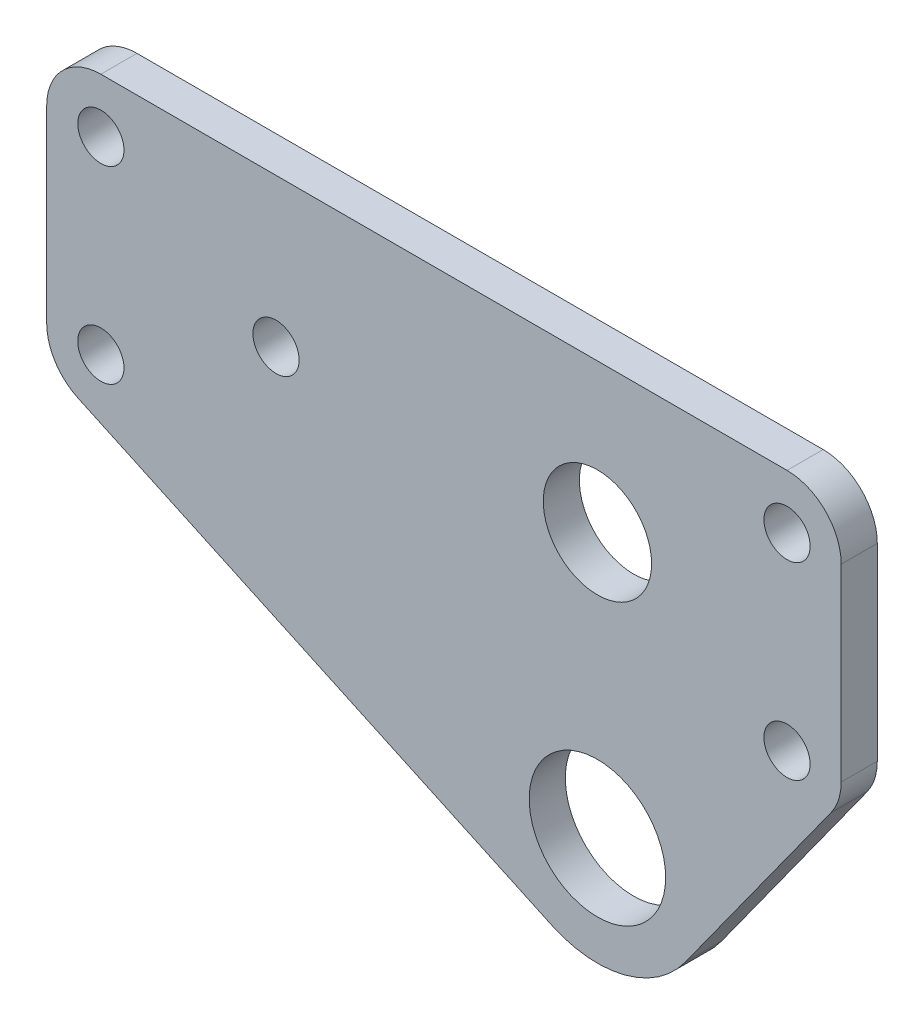
ISO-10303-21;
HEADER;
FILE_DESCRIPTION(('STEP AP214'),'2;1');
FILE_NAME('part.step','',(''),(''),'','','');
FILE_SCHEMA(('AUTOMOTIVE_DESIGN { 1 0 10303 214 1 1 1 1 }'));
ENDSEC;
DATA;
#1=APPLICATION_CONTEXT('core data for automotive mechanical design processes');
#2=APPLICATION_PROTOCOL_DEFINITION('international standard','automotive_design',2000,#1);
#3=PRODUCT_CONTEXT('',#1,'mechanical');
#4=PRODUCT('Part','Part','',(#3));
#5=PRODUCT_RELATED_PRODUCT_CATEGORY('part','',(#4));
#6=PRODUCT_DEFINITION_FORMATION('','',#4);
#7=PRODUCT_DEFINITION_CONTEXT('part definition',#1,'design');
#8=PRODUCT_DEFINITION('design','',#6,#7);
#9=PRODUCT_DEFINITION_SHAPE('','',#8);
#10=(LENGTH_UNIT() NAMED_UNIT(*) SI_UNIT(.MILLI.,.METRE.));
#11=(NAMED_UNIT(*) PLANE_ANGLE_UNIT() SI_UNIT($,.RADIAN.));
#12=(NAMED_UNIT(*) SI_UNIT($,.STERADIAN.) SOLID_ANGLE_UNIT());
#13=UNCERTAINTY_MEASURE_WITH_UNIT(LENGTH_MEASURE(1.E-05),#10,'distance_accuracy_value','');
#14=(GEOMETRIC_REPRESENTATION_CONTEXT(3) GLOBAL_UNCERTAINTY_ASSIGNED_CONTEXT((#13)) GLOBAL_UNIT_ASSIGNED_CONTEXT((#10,
#11,#12)) REPRESENTATION_CONTEXT('',''));
#15=CARTESIAN_POINT('',(0.,0.,0.));
#16=DIRECTION('',(0.,0.,1.));
#17=DIRECTION('',(1.,0.,0.));
#18=AXIS2_PLACEMENT_3D('',#15,#16,#17);
#19=CARTESIAN_POINT('',(43.65625,-8.29309999999999,3.175));
#20=DIRECTION('',(0.,0.,-1.));
#21=DIRECTION('',(-1.,0.,0.));
#22=AXIS2_PLACEMENT_3D('',#19,#20,#21);
#23=CYLINDRICAL_SURFACE('',#22,4.7625);
#24=DIRECTION('',(0.,0.,1.));
#25=VECTOR('',#24,1.);
#26=CARTESIAN_POINT('',(47.520433425221,-11.0768910672763,-69.6683702911285));
#27=LINE('',#26,#25);
#28=CARTESIAN_POINT('',(47.520433425221,-11.0768910672763,0.));
#29=VERTEX_POINT('',#28);
#30=CARTESIAN_POINT('',(47.520433425221,-11.0768910672763,3.175));
#31=VERTEX_POINT('',#30);
#32=EDGE_CURVE('E126',#29,#31,#27,.T.);
#33=ORIENTED_EDGE('',*,*,#32,.F.);
#34=CARTESIAN_POINT('',(43.65625,-8.29309999999999,0.));
#35=DIRECTION('',(0.,0.,1.));
#36=DIRECTION('',(1.,0.,0.));
#37=AXIS2_PLACEMENT_3D('',#34,#35,#36);
#38=CIRCLE('',#37,4.7625);
#39=CARTESIAN_POINT('',(48.41875,-8.29309999999999,0.));
#40=VERTEX_POINT('',#39);
#41=EDGE_CURVE('E218',#29,#40,#38,.T.);
#42=ORIENTED_EDGE('',*,*,#41,.T.);
#43=DIRECTION('',(0.,0.,-1.));
#44=VECTOR('',#43,1.);
#45=CARTESIAN_POINT('',(48.41875,-8.29309999999999,3.175));
#46=LINE('',#45,#44);
#47=CARTESIAN_POINT('',(48.41875,-8.29309999999999,3.175));
#48=VERTEX_POINT('',#47);
#49=EDGE_CURVE('E221',#48,#40,#46,.T.);
#50=ORIENTED_EDGE('',*,*,#49,.F.);
#51=CARTESIAN_POINT('',(43.65625,-8.29309999999999,3.175));
#52=DIRECTION('',(0.,0.,1.));
#53=DIRECTION('',(1.,0.,0.));
#54=AXIS2_PLACEMENT_3D('',#51,#52,#53);
#55=CIRCLE('',#54,4.7625);
#56=EDGE_CURVE('E202',#31,#48,#55,.T.);
#57=ORIENTED_EDGE('',*,*,#56,.F.);
#58=EDGE_LOOP('',(#33,#42,#50,#57));
#59=FACE_BOUND('',#58,.T.);
#60=ADVANCED_FACE('F39',(#59),#23,.T.);
#61=CARTESIAN_POINT('',(43.65625,8.29310000000001,3.175));
#62=DIRECTION('',(0.,0.,1.));
#63=DIRECTION('',(1.,0.,0.));
#64=AXIS2_PLACEMENT_3D('',#61,#62,#63);
#65=PLANE('',#64);
#66=CARTESIAN_POINT('',(-16.66875,-8.2931,3.175));
#67=DIRECTION('',(0.,0.,1.));
#68=DIRECTION('',(-1.,0.,0.));
#69=AXIS2_PLACEMENT_3D('',#66,#67,#68);
#70=CIRCLE('',#69,4.7625);
#71=CARTESIAN_POINT('',(-21.43125,-8.2931,3.175));
#72=VERTEX_POINT('',#71);
#73=CARTESIAN_POINT('',(-18.6719065249047,-12.6138372272254,3.175));
#74=VERTEX_POINT('',#73);
#75=EDGE_CURVE('E201',#72,#74,#70,.T.);
#76=ORIENTED_EDGE('',*,*,#75,.T.);
#77=DIRECTION('',(0.907241412540773,-0.420610293943244,0.));
#78=VECTOR('',#77,1.);
#79=CARTESIAN_POINT('',(22.9811869501906,-31.9248162544509,3.175));
#80=LINE('',#79,#78);
#81=CARTESIAN_POINT('',(22.9811869501906,-31.9248162544509,3.175));
#82=VERTEX_POINT('',#81);
#83=EDGE_CURVE('E129',#74,#82,#80,.T.);
#84=ORIENTED_EDGE('',*,*,#83,.T.);
#85=CARTESIAN_POINT('',(26.9875,-23.2833418,3.175));
#86=DIRECTION('',(0.,0.,1.));
#87=DIRECTION('',(1.,0.,0.));
#88=AXIS2_PLACEMENT_3D('',#85,#86,#87);
#89=CIRCLE('',#88,9.525);
#90=CARTESIAN_POINT('',(34.715866850442,-28.8509239345526,3.175));
#91=VERTEX_POINT('',#90);
#92=EDGE_CURVE('E125',#82,#91,#89,.T.);
#93=ORIENTED_EDGE('',*,*,#92,.T.);
#94=DIRECTION('',(0.584523058745685,0.81137709715926,0.));
#95=VECTOR('',#94,1.);
#96=CARTESIAN_POINT('',(34.715866850442,-28.8509239345526,3.175));
#97=LINE('',#96,#95);
#98=EDGE_CURVE('E135',#91,#31,#97,.T.);
#99=ORIENTED_EDGE('',*,*,#98,.T.);
#100=ORIENTED_EDGE('',*,*,#56,.T.);
#101=DIRECTION('',(0.,1.,0.));
#102=VECTOR('',#101,1.);
#103=CARTESIAN_POINT('',(48.41875,-8.29309999999999,3.175));
#104=LINE('',#103,#102);
#105=CARTESIAN_POINT('',(48.41875,8.29310000000001,3.175));
#106=VERTEX_POINT('',#105);
#107=EDGE_CURVE('E210',#48,#106,#104,.T.);
#108=ORIENTED_EDGE('',*,*,#107,.T.);
#109=CARTESIAN_POINT('',(43.65625,8.29310000000001,3.175));
#110=DIRECTION('',(0.,0.,1.));
#111=DIRECTION('',(1.,0.,0.));
#112=AXIS2_PLACEMENT_3D('',#109,#110,#111);
#113=CIRCLE('',#112,4.7625);
#114=CARTESIAN_POINT('',(43.65625,13.0556,3.175));
#115=VERTEX_POINT('',#114);
#116=EDGE_CURVE('E195',#106,#115,#113,.T.);
#117=ORIENTED_EDGE('',*,*,#116,.T.);
#118=DIRECTION('',(-1.,0.,0.));
#119=VECTOR('',#118,1.);
#120=CARTESIAN_POINT('',(43.65625,13.0556,3.175));
#121=LINE('',#120,#119);
#122=CARTESIAN_POINT('',(-16.66875,13.0556,3.175));
#123=VERTEX_POINT('',#122);
#124=EDGE_CURVE('E198',#115,#123,#121,.T.);
#125=ORIENTED_EDGE('',*,*,#124,.T.);
#126=CARTESIAN_POINT('',(-16.66875,8.2931,3.175));
#127=DIRECTION('',(0.,0.,1.));
#128=DIRECTION('',(1.,0.,0.));
#129=AXIS2_PLACEMENT_3D('',#126,#127,#128);
#130=CIRCLE('',#129,4.7625);
#131=CARTESIAN_POINT('',(-21.43125,8.2931,3.175));
#132=VERTEX_POINT('',#131);
#133=EDGE_CURVE('E200',#123,#132,#130,.T.);
#134=ORIENTED_EDGE('',*,*,#133,.T.);
#135=DIRECTION('',(0.,-1.,0.));
#136=VECTOR('',#135,1.);
#137=CARTESIAN_POINT('',(-21.43125,-8.2931,3.175));
#138=LINE('',#137,#136);
#139=EDGE_CURVE('E203',#132,#72,#138,.T.);
#140=ORIENTED_EDGE('',*,*,#139,.T.);
#141=EDGE_LOOP('',(#76,#84,#93,#99,#100,#108,#117,#125,#134,#140));
#142=FACE_BOUND('',#141,.T.);
#143=CARTESIAN_POINT('',(43.65625,-8.29309999999999,3.175));
#144=DIRECTION('',(0.,0.,1.));
#145=DIRECTION('',(1.,0.,0.));
#146=AXIS2_PLACEMENT_3D('',#143,#144,#145);
#147=CIRCLE('',#146,2.032);
#148=CARTESIAN_POINT('',(45.68825,-8.29309999999999,3.175));
#149=VERTEX_POINT('',#148);
#150=EDGE_CURVE('E162',#149,#149,#147,.T.);
#151=ORIENTED_EDGE('',*,*,#150,.F.);
#152=EDGE_LOOP('',(#151));
#153=FACE_BOUND('',#152,.T.);
#154=CARTESIAN_POINT('',(43.65625,8.29310000000001,3.175));
#155=DIRECTION('',(0.,0.,1.));
#156=DIRECTION('',(1.,0.,0.));
#157=AXIS2_PLACEMENT_3D('',#154,#155,#156);
#158=CIRCLE('',#157,2.032);
#159=CARTESIAN_POINT('',(45.68825,8.29310000000001,3.175));
#160=VERTEX_POINT('',#159);
#161=EDGE_CURVE('E172',#160,#160,#158,.T.);
#162=ORIENTED_EDGE('',*,*,#161,.F.);
#163=EDGE_LOOP('',(#162));
#164=FACE_BOUND('',#163,.T.);
#165=CARTESIAN_POINT('',(26.9875,0.,3.175));
#166=DIRECTION('',(0.,0.,1.));
#167=DIRECTION('',(1.,0.,0.));
#168=AXIS2_PLACEMENT_3D('',#165,#166,#167);
#169=CIRCLE('',#168,4.7625);
#170=CARTESIAN_POINT('',(31.75,0.,3.175));
#171=VERTEX_POINT('',#170);
#172=EDGE_CURVE('E186',#171,#171,#169,.T.);
#173=ORIENTED_EDGE('',*,*,#172,.F.);
#174=EDGE_LOOP('',(#173));
#175=FACE_BOUND('',#174,.T.);
#176=CARTESIAN_POINT('',(-16.66875,8.2931,3.175));
#177=DIRECTION('',(0.,0.,1.));
#178=DIRECTION('',(1.,0.,0.));
#179=AXIS2_PLACEMENT_3D('',#176,#177,#178);
#180=CIRCLE('',#179,2.032);
#181=CARTESIAN_POINT('',(-14.63675,8.2931,3.175));
#182=VERTEX_POINT('',#181);
#183=EDGE_CURVE('E182',#182,#182,#180,.T.);
#184=ORIENTED_EDGE('',*,*,#183,.F.);
#185=EDGE_LOOP('',(#184));
#186=FACE_BOUND('',#185,.T.);
#187=CARTESIAN_POINT('',(-16.66875,-8.2931,3.175));
#188=DIRECTION('',(0.,0.,1.));
#189=DIRECTION('',(1.,0.,0.));
#190=AXIS2_PLACEMENT_3D('',#187,#188,#189);
#191=CIRCLE('',#190,2.032);
#192=CARTESIAN_POINT('',(-14.63675,-8.2931,3.175));
#193=VERTEX_POINT('',#192);
#194=EDGE_CURVE('E166',#193,#193,#191,.T.);
#195=ORIENTED_EDGE('',*,*,#194,.F.);
#196=EDGE_LOOP('',(#195));
#197=FACE_BOUND('',#196,.T.);
#198=CARTESIAN_POINT('',(-1.27,0.,3.175));
#199=DIRECTION('',(0.,0.,1.));
#200=DIRECTION('',(1.,0.,0.));
#201=AXIS2_PLACEMENT_3D('',#198,#199,#200);
#202=CIRCLE('',#201,2.032);
#203=CARTESIAN_POINT('',(0.761999999999996,0.,3.175));
#204=VERTEX_POINT('',#203);
#205=EDGE_CURVE('E160',#204,#204,#202,.T.);
#206=ORIENTED_EDGE('',*,*,#205,.F.);
#207=EDGE_LOOP('',(#206));
#208=FACE_BOUND('',#207,.T.);
#209=CARTESIAN_POINT('',(26.9875,-23.2833418,3.175));
#210=DIRECTION('',(0.,0.,1.));
#211=DIRECTION('',(1.,0.,0.));
#212=AXIS2_PLACEMENT_3D('',#209,#210,#211);
#213=CIRCLE('',#212,6.);
#214=CARTESIAN_POINT('',(32.9875,-23.2833418,3.175));
#215=VERTEX_POINT('',#214);
#216=EDGE_CURVE('E137',#215,#215,#213,.T.);
#217=ORIENTED_EDGE('',*,*,#216,.F.);
#218=EDGE_LOOP('',(#217));
#219=FACE_BOUND('',#218,.T.);
#220=ADVANCED_FACE('F136',(#142,#153,#164,#175,#186,#197,#208,#219),#65,.T.);
#221=CARTESIAN_POINT('',(43.65625,8.29310000000001,0.));
#222=DIRECTION('',(0.,0.,1.));
#223=DIRECTION('',(1.,0.,0.));
#224=AXIS2_PLACEMENT_3D('',#221,#222,#223);
#225=PLANE('',#224);
#226=ORIENTED_EDGE('',*,*,#41,.F.);
#227=DIRECTION('',(-0.584523058745685,-0.81137709715926,0.));
#228=VECTOR('',#227,1.);
#229=CARTESIAN_POINT('',(34.715866850442,-28.8509239345526,0.));
#230=LINE('',#229,#228);
#231=CARTESIAN_POINT('',(34.715866850442,-28.8509239345526,0.));
#232=VERTEX_POINT('',#231);
#233=EDGE_CURVE('E156',#29,#232,#230,.T.);
#234=ORIENTED_EDGE('',*,*,#233,.T.);
#235=CARTESIAN_POINT('',(26.9875,-23.2833418,0.));
#236=DIRECTION('',(0.,0.,1.));
#237=DIRECTION('',(1.,0.,0.));
#238=AXIS2_PLACEMENT_3D('',#235,#236,#237);
#239=CIRCLE('',#238,9.525);
#240=CARTESIAN_POINT('',(22.9811869501906,-31.9248162544509,0.));
#241=VERTEX_POINT('',#240);
#242=EDGE_CURVE('E122',#232,#241,#239,.F.);
#243=ORIENTED_EDGE('',*,*,#242,.T.);
#244=DIRECTION('',(-0.907241412540774,0.420610293943244,0.));
#245=VECTOR('',#244,1.);
#246=CARTESIAN_POINT('',(22.9811869501906,-31.9248162544509,0.));
#247=LINE('',#246,#245);
#248=CARTESIAN_POINT('',(-18.6719065249047,-12.6138372272254,0.));
#249=VERTEX_POINT('',#248);
#250=EDGE_CURVE('E149',#241,#249,#247,.T.);
#251=ORIENTED_EDGE('',*,*,#250,.T.);
#252=CARTESIAN_POINT('',(-16.66875,-8.2931,0.));
#253=DIRECTION('',(0.,0.,1.));
#254=DIRECTION('',(-1.,0.,0.));
#255=AXIS2_PLACEMENT_3D('',#252,#253,#254);
#256=CIRCLE('',#255,4.7625);
#257=CARTESIAN_POINT('',(-21.43125,-8.2931,0.));
#258=VERTEX_POINT('',#257);
#259=EDGE_CURVE('E56',#258,#249,#256,.T.);
#260=ORIENTED_EDGE('',*,*,#259,.F.);
#261=DIRECTION('',(0.,-1.,0.));
#262=VECTOR('',#261,1.);
#263=CARTESIAN_POINT('',(-21.43125,-8.2931,0.));
#264=LINE('',#263,#262);
#265=CARTESIAN_POINT('',(-21.43125,8.2931,0.));
#266=VERTEX_POINT('',#265);
#267=EDGE_CURVE('E216',#266,#258,#264,.T.);
#268=ORIENTED_EDGE('',*,*,#267,.F.);
#269=CARTESIAN_POINT('',(-16.66875,8.2931,0.));
#270=DIRECTION('',(0.,0.,1.));
#271=DIRECTION('',(1.,0.,0.));
#272=AXIS2_PLACEMENT_3D('',#269,#270,#271);
#273=CIRCLE('',#272,4.7625);
#274=CARTESIAN_POINT('',(-16.66875,13.0556,0.));
#275=VERTEX_POINT('',#274);
#276=EDGE_CURVE('E212',#275,#266,#273,.T.);
#277=ORIENTED_EDGE('',*,*,#276,.F.);
#278=DIRECTION('',(-1.,0.,0.));
#279=VECTOR('',#278,1.);
#280=CARTESIAN_POINT('',(43.65625,13.0556,0.));
#281=LINE('',#280,#279);
#282=CARTESIAN_POINT('',(43.65625,13.0556,0.));
#283=VERTEX_POINT('',#282);
#284=EDGE_CURVE('E215',#283,#275,#281,.T.);
#285=ORIENTED_EDGE('',*,*,#284,.F.);
#286=CARTESIAN_POINT('',(43.65625,8.29310000000001,0.));
#287=DIRECTION('',(0.,0.,1.));
#288=DIRECTION('',(1.,0.,0.));
#289=AXIS2_PLACEMENT_3D('',#286,#287,#288);
#290=CIRCLE('',#289,4.7625);
#291=CARTESIAN_POINT('',(48.41875,8.29310000000001,0.));
#292=VERTEX_POINT('',#291);
#293=EDGE_CURVE('E187',#292,#283,#290,.T.);
#294=ORIENTED_EDGE('',*,*,#293,.F.);
#295=DIRECTION('',(0.,1.,0.));
#296=VECTOR('',#295,1.);
#297=CARTESIAN_POINT('',(48.41875,-8.29309999999999,0.));
#298=LINE('',#297,#296);
#299=EDGE_CURVE('E197',#40,#292,#298,.T.);
#300=ORIENTED_EDGE('',*,*,#299,.F.);
#301=EDGE_LOOP('',(#226,#234,#243,#251,#260,#268,#277,#285,#294,#300));
#302=FACE_BOUND('',#301,.T.);
#303=CARTESIAN_POINT('',(26.9875,0.,0.));
#304=DIRECTION('',(0.,0.,1.));
#305=DIRECTION('',(1.,0.,0.));
#306=AXIS2_PLACEMENT_3D('',#303,#304,#305);
#307=CIRCLE('',#306,4.7625);
#308=CARTESIAN_POINT('',(31.75,0.,0.));
#309=VERTEX_POINT('',#308);
#310=EDGE_CURVE('E184',#309,#309,#307,.T.);
#311=ORIENTED_EDGE('',*,*,#310,.T.);
#312=EDGE_LOOP('',(#311));
#313=FACE_BOUND('',#312,.T.);
#314=CARTESIAN_POINT('',(-16.66875,8.2931,0.));
#315=DIRECTION('',(0.,0.,1.));
#316=DIRECTION('',(1.,0.,0.));
#317=AXIS2_PLACEMENT_3D('',#314,#315,#316);
#318=CIRCLE('',#317,2.032);
#319=CARTESIAN_POINT('',(-14.63675,8.2931,0.));
#320=VERTEX_POINT('',#319);
#321=EDGE_CURVE('E180',#320,#320,#318,.T.);
#322=ORIENTED_EDGE('',*,*,#321,.T.);
#323=EDGE_LOOP('',(#322));
#324=FACE_BOUND('',#323,.T.);
#325=CARTESIAN_POINT('',(43.65625,8.29310000000001,0.));
#326=DIRECTION('',(0.,0.,1.));
#327=DIRECTION('',(1.,0.,0.));
#328=AXIS2_PLACEMENT_3D('',#325,#326,#327);
#329=CIRCLE('',#328,2.032);
#330=CARTESIAN_POINT('',(45.68825,8.29310000000001,0.));
#331=VERTEX_POINT('',#330);
#332=EDGE_CURVE('E171',#331,#331,#329,.T.);
#333=ORIENTED_EDGE('',*,*,#332,.T.);
#334=EDGE_LOOP('',(#333));
#335=FACE_BOUND('',#334,.T.);
#336=CARTESIAN_POINT('',(-16.66875,-8.2931,0.));
#337=DIRECTION('',(0.,0.,1.));
#338=DIRECTION('',(1.,0.,0.));
#339=AXIS2_PLACEMENT_3D('',#336,#337,#338);
#340=CIRCLE('',#339,2.032);
#341=CARTESIAN_POINT('',(-14.63675,-8.2931,0.));
#342=VERTEX_POINT('',#341);
#343=EDGE_CURVE('E167',#342,#342,#340,.T.);
#344=ORIENTED_EDGE('',*,*,#343,.T.);
#345=EDGE_LOOP('',(#344));
#346=FACE_BOUND('',#345,.T.);
#347=CARTESIAN_POINT('',(43.65625,-8.29309999999999,0.));
#348=DIRECTION('',(0.,0.,1.));
#349=DIRECTION('',(1.,0.,0.));
#350=AXIS2_PLACEMENT_3D('',#347,#348,#349);
#351=CIRCLE('',#350,2.032);
#352=CARTESIAN_POINT('',(45.68825,-8.29309999999999,0.));
#353=VERTEX_POINT('',#352);
#354=EDGE_CURVE('E159',#353,#353,#351,.T.);
#355=ORIENTED_EDGE('',*,*,#354,.T.);
#356=EDGE_LOOP('',(#355));
#357=FACE_BOUND('',#356,.T.);
#358=CARTESIAN_POINT('',(-1.27,0.,0.));
#359=DIRECTION('',(0.,0.,1.));
#360=DIRECTION('',(1.,0.,0.));
#361=AXIS2_PLACEMENT_3D('',#358,#359,#360);
#362=CIRCLE('',#361,2.032);
#363=CARTESIAN_POINT('',(0.761999999999996,0.,0.));
#364=VERTEX_POINT('',#363);
#365=EDGE_CURVE('E154',#364,#364,#362,.T.);
#366=ORIENTED_EDGE('',*,*,#365,.T.);
#367=EDGE_LOOP('',(#366));
#368=FACE_BOUND('',#367,.T.);
#369=CARTESIAN_POINT('',(26.9875,-23.2833418,0.));
#370=DIRECTION('',(0.,0.,1.));
#371=DIRECTION('',(1.,0.,0.));
#372=AXIS2_PLACEMENT_3D('',#369,#370,#371);
#373=CIRCLE('',#372,6.);
#374=CARTESIAN_POINT('',(32.9875,-23.2833418,0.));
#375=VERTEX_POINT('',#374);
#376=EDGE_CURVE('E155',#375,#375,#373,.F.);
#377=ORIENTED_EDGE('',*,*,#376,.F.);
#378=EDGE_LOOP('',(#377));
#379=FACE_BOUND('',#378,.T.);
#380=ADVANCED_FACE('F241',(#302,#313,#324,#335,#346,#357,#368,#379),#225,.F.);
#381=CARTESIAN_POINT('',(43.65625,8.29310000000001,3.175));
#382=DIRECTION('',(0.,0.,-1.));
#383=DIRECTION('',(-1.,0.,0.));
#384=AXIS2_PLACEMENT_3D('',#381,#382,#383);
#385=CYLINDRICAL_SURFACE('',#384,4.7625);
#386=ORIENTED_EDGE('',*,*,#293,.T.);
#387=DIRECTION('',(0.,0.,-1.));
#388=VECTOR('',#387,1.);
#389=CARTESIAN_POINT('',(43.65625,13.0556,3.175));
#390=LINE('',#389,#388);
#391=EDGE_CURVE('E11',#115,#283,#390,.T.);
#392=ORIENTED_EDGE('',*,*,#391,.F.);
#393=ORIENTED_EDGE('',*,*,#116,.F.);
#394=DIRECTION('',(0.,0.,-1.));
#395=VECTOR('',#394,1.);
#396=CARTESIAN_POINT('',(48.41875,8.29310000000001,3.175));
#397=LINE('',#396,#395);
#398=EDGE_CURVE('E207',#106,#292,#397,.T.);
#399=ORIENTED_EDGE('',*,*,#398,.T.);
#400=EDGE_LOOP('',(#386,#392,#393,#399));
#401=FACE_BOUND('',#400,.T.);
#402=ADVANCED_FACE('F41',(#401),#385,.T.);
#403=CARTESIAN_POINT('',(43.65625,13.0556,3.175));
#404=DIRECTION('',(0.,-1.,0.));
#405=DIRECTION('',(1.,0.,0.));
#406=AXIS2_PLACEMENT_3D('',#403,#404,#405);
#407=PLANE('',#406);
#408=ORIENTED_EDGE('',*,*,#284,.T.);
#409=DIRECTION('',(0.,0.,-1.));
#410=VECTOR('',#409,1.);
#411=CARTESIAN_POINT('',(-16.66875,13.0556,3.175));
#412=LINE('',#411,#410);
#413=EDGE_CURVE('E50',#123,#275,#412,.T.);
#414=ORIENTED_EDGE('',*,*,#413,.F.);
#415=ORIENTED_EDGE('',*,*,#124,.F.);
#416=ORIENTED_EDGE('',*,*,#391,.T.);
#417=EDGE_LOOP('',(#408,#414,#415,#416));
#418=FACE_BOUND('',#417,.T.);
#419=ADVANCED_FACE('F264',(#418),#407,.F.);
#420=CARTESIAN_POINT('',(-16.66875,8.2931,3.175));
#421=DIRECTION('',(0.,0.,-1.));
#422=DIRECTION('',(-1.,0.,0.));
#423=AXIS2_PLACEMENT_3D('',#420,#421,#422);
#424=CYLINDRICAL_SURFACE('',#423,4.7625);
#425=ORIENTED_EDGE('',*,*,#276,.T.);
#426=DIRECTION('',(0.,0.,-1.));
#427=VECTOR('',#426,1.);
#428=CARTESIAN_POINT('',(-21.43125,8.2931,3.175));
#429=LINE('',#428,#427);
#430=EDGE_CURVE('E228',#132,#266,#429,.T.);
#431=ORIENTED_EDGE('',*,*,#430,.F.);
#432=ORIENTED_EDGE('',*,*,#133,.F.);
#433=ORIENTED_EDGE('',*,*,#413,.T.);
#434=EDGE_LOOP('',(#425,#431,#432,#433));
#435=FACE_BOUND('',#434,.T.);
#436=ADVANCED_FACE('F237',(#435),#424,.T.);
#437=CARTESIAN_POINT('',(-21.43125,-8.2931,3.175));
#438=DIRECTION('',(1.,0.,0.));
#439=DIRECTION('',(0.,0.,-1.));
#440=AXIS2_PLACEMENT_3D('',#437,#438,#439);
#441=PLANE('',#440);
#442=ORIENTED_EDGE('',*,*,#267,.T.);
#443=DIRECTION('',(0.,0.,-1.));
#444=VECTOR('',#443,1.);
#445=CARTESIAN_POINT('',(-21.43125,-8.2931,3.175));
#446=LINE('',#445,#444);
#447=EDGE_CURVE('E226',#72,#258,#446,.T.);
#448=ORIENTED_EDGE('',*,*,#447,.F.);
#449=ORIENTED_EDGE('',*,*,#139,.F.);
#450=ORIENTED_EDGE('',*,*,#430,.T.);
#451=EDGE_LOOP('',(#442,#448,#449,#450));
#452=FACE_BOUND('',#451,.T.);
#453=ADVANCED_FACE('F246',(#452),#441,.F.);
#454=CARTESIAN_POINT('',(-16.66875,-8.2931,3.175));
#455=DIRECTION('',(0.,0.,-1.));
#456=DIRECTION('',(-1.,0.,0.));
#457=AXIS2_PLACEMENT_3D('',#454,#455,#456);
#458=CYLINDRICAL_SURFACE('',#457,4.7625);
#459=ORIENTED_EDGE('',*,*,#259,.T.);
#460=DIRECTION('',(0.,0.,1.));
#461=VECTOR('',#460,1.);
#462=CARTESIAN_POINT('',(-18.6719065249047,-12.6138372272254,-69.6683702911285));
#463=LINE('',#462,#461);
#464=EDGE_CURVE('E53',#249,#74,#463,.T.);
#465=ORIENTED_EDGE('',*,*,#464,.T.);
#466=ORIENTED_EDGE('',*,*,#75,.F.);
#467=ORIENTED_EDGE('',*,*,#447,.T.);
#468=EDGE_LOOP('',(#459,#465,#466,#467));
#469=FACE_BOUND('',#468,.T.);
#470=ADVANCED_FACE('F248',(#469),#458,.T.);
#471=CARTESIAN_POINT('',(48.41875,-8.29309999999999,3.175));
#472=DIRECTION('',(-1.,0.,0.));
#473=DIRECTION('',(0.,0.,1.));
#474=AXIS2_PLACEMENT_3D('',#471,#472,#473);
#475=PLANE('',#474);
#476=ORIENTED_EDGE('',*,*,#299,.T.);
#477=ORIENTED_EDGE('',*,*,#398,.F.);
#478=ORIENTED_EDGE('',*,*,#107,.F.);
#479=ORIENTED_EDGE('',*,*,#49,.T.);
#480=EDGE_LOOP('',(#476,#477,#478,#479));
#481=FACE_BOUND('',#480,.T.);
#482=ADVANCED_FACE('F257',(#481),#475,.F.);
#483=CARTESIAN_POINT('',(26.9875,0.,3.175));
#484=DIRECTION('',(0.,0.,-1.));
#485=DIRECTION('',(-1.,0.,0.));
#486=AXIS2_PLACEMENT_3D('',#483,#484,#485);
#487=CYLINDRICAL_SURFACE('',#486,4.7625);
#488=ORIENTED_EDGE('',*,*,#172,.T.);
#489=EDGE_LOOP('',(#488));
#490=FACE_BOUND('',#489,.T.);
#491=ORIENTED_EDGE('',*,*,#310,.F.);
#492=EDGE_LOOP('',(#491));
#493=FACE_BOUND('',#492,.T.);
#494=ADVANCED_FACE('F296',(#490,#493),#487,.F.);
#495=CARTESIAN_POINT('',(-16.66875,8.2931,3.175));
#496=DIRECTION('',(0.,0.,-1.));
#497=DIRECTION('',(-1.,0.,0.));
#498=AXIS2_PLACEMENT_3D('',#495,#496,#497);
#499=CYLINDRICAL_SURFACE('',#498,2.032);
#500=ORIENTED_EDGE('',*,*,#183,.T.);
#501=EDGE_LOOP('',(#500));
#502=FACE_BOUND('',#501,.T.);
#503=ORIENTED_EDGE('',*,*,#321,.F.);
#504=EDGE_LOOP('',(#503));
#505=FACE_BOUND('',#504,.T.);
#506=ADVANCED_FACE('F303',(#502,#505),#499,.F.);
#507=CARTESIAN_POINT('',(43.65625,8.29310000000001,3.175));
#508=DIRECTION('',(0.,0.,-1.));
#509=DIRECTION('',(-1.,0.,0.));
#510=AXIS2_PLACEMENT_3D('',#507,#508,#509);
#511=CYLINDRICAL_SURFACE('',#510,2.032);
#512=ORIENTED_EDGE('',*,*,#161,.T.);
#513=EDGE_LOOP('',(#512));
#514=FACE_BOUND('',#513,.T.);
#515=ORIENTED_EDGE('',*,*,#332,.F.);
#516=EDGE_LOOP('',(#515));
#517=FACE_BOUND('',#516,.T.);
#518=ADVANCED_FACE('F311',(#514,#517),#511,.F.);
#519=CARTESIAN_POINT('',(-16.66875,-8.2931,3.175));
#520=DIRECTION('',(0.,0.,-1.));
#521=DIRECTION('',(-1.,0.,0.));
#522=AXIS2_PLACEMENT_3D('',#519,#520,#521);
#523=CYLINDRICAL_SURFACE('',#522,2.032);
#524=ORIENTED_EDGE('',*,*,#194,.T.);
#525=EDGE_LOOP('',(#524));
#526=FACE_BOUND('',#525,.T.);
#527=ORIENTED_EDGE('',*,*,#343,.F.);
#528=EDGE_LOOP('',(#527));
#529=FACE_BOUND('',#528,.T.);
#530=ADVANCED_FACE('F325',(#526,#529),#523,.F.);
#531=CARTESIAN_POINT('',(43.65625,-8.29309999999999,3.175));
#532=DIRECTION('',(0.,0.,-1.));
#533=DIRECTION('',(-1.,0.,0.));
#534=AXIS2_PLACEMENT_3D('',#531,#532,#533);
#535=CYLINDRICAL_SURFACE('',#534,2.032);
#536=ORIENTED_EDGE('',*,*,#150,.T.);
#537=EDGE_LOOP('',(#536));
#538=FACE_BOUND('',#537,.T.);
#539=ORIENTED_EDGE('',*,*,#354,.F.);
#540=EDGE_LOOP('',(#539));
#541=FACE_BOUND('',#540,.T.);
#542=ADVANCED_FACE('F332',(#538,#541),#535,.F.);
#543=CARTESIAN_POINT('',(-1.27,0.,3.175));
#544=DIRECTION('',(0.,0.,-1.));
#545=DIRECTION('',(-1.,0.,0.));
#546=AXIS2_PLACEMENT_3D('',#543,#544,#545);
#547=CYLINDRICAL_SURFACE('',#546,2.032);
#548=ORIENTED_EDGE('',*,*,#205,.T.);
#549=EDGE_LOOP('',(#548));
#550=FACE_BOUND('',#549,.T.);
#551=ORIENTED_EDGE('',*,*,#365,.F.);
#552=EDGE_LOOP('',(#551));
#553=FACE_BOUND('',#552,.T.);
#554=ADVANCED_FACE('F338',(#550,#553),#547,.F.);
#555=CARTESIAN_POINT('',(34.715866850442,-28.8509239345526,-69.6683702911285));
#556=DIRECTION('',(0.81137709715926,-0.584523058745685,0.));
#557=DIRECTION('',(0.584523058745685,0.81137709715926,0.));
#558=AXIS2_PLACEMENT_3D('',#555,#556,#557);
#559=PLANE('',#558);
#560=ORIENTED_EDGE('',*,*,#233,.F.);
#561=ORIENTED_EDGE('',*,*,#32,.T.);
#562=ORIENTED_EDGE('',*,*,#98,.F.);
#563=DIRECTION('',(0.,0.,1.));
#564=VECTOR('',#563,1.);
#565=CARTESIAN_POINT('',(34.715866850442,-28.8509239345526,-69.6683702911285));
#566=LINE('',#565,#564);
#567=EDGE_CURVE('E120',#232,#91,#566,.T.);
#568=ORIENTED_EDGE('',*,*,#567,.F.);
#569=EDGE_LOOP('',(#560,#561,#562,#568));
#570=FACE_BOUND('',#569,.T.);
#571=ADVANCED_FACE('F133',(#570),#559,.T.);
#572=CARTESIAN_POINT('',(22.9811869501906,-31.9248162544509,-69.6683702911285));
#573=DIRECTION('',(-0.420610293943244,-0.907241412540773,0.));
#574=DIRECTION('',(0.907241412540774,-0.420610293943244,0.));
#575=AXIS2_PLACEMENT_3D('',#572,#573,#574);
#576=PLANE('',#575);
#577=ORIENTED_EDGE('',*,*,#250,.F.);
#578=DIRECTION('',(0.,0.,1.));
#579=VECTOR('',#578,1.);
#580=CARTESIAN_POINT('',(22.9811869501906,-31.9248162544509,-69.6683702911285));
#581=LINE('',#580,#579);
#582=EDGE_CURVE('E150',#241,#82,#581,.T.);
#583=ORIENTED_EDGE('',*,*,#582,.T.);
#584=ORIENTED_EDGE('',*,*,#83,.F.);
#585=ORIENTED_EDGE('',*,*,#464,.F.);
#586=EDGE_LOOP('',(#577,#583,#584,#585));
#587=FACE_BOUND('',#586,.T.);
#588=ADVANCED_FACE('F252',(#587),#576,.T.);
#589=CARTESIAN_POINT('',(26.9875,-23.2833418,-69.6683702911285));
#590=DIRECTION('',(0.,0.,1.));
#591=DIRECTION('',(1.,0.,0.));
#592=AXIS2_PLACEMENT_3D('',#589,#590,#591);
#593=CYLINDRICAL_SURFACE('',#592,9.525);
#594=ORIENTED_EDGE('',*,*,#242,.F.);
#595=ORIENTED_EDGE('',*,*,#567,.T.);
#596=ORIENTED_EDGE('',*,*,#92,.F.);
#597=ORIENTED_EDGE('',*,*,#582,.F.);
#598=EDGE_LOOP('',(#594,#595,#596,#597));
#599=FACE_BOUND('',#598,.T.);
#600=ADVANCED_FACE('F117',(#599),#593,.T.);
#601=CARTESIAN_POINT('',(26.9875,-23.2833418,-69.6683702911285));
#602=DIRECTION('',(0.,0.,1.));
#603=DIRECTION('',(1.,0.,0.));
#604=AXIS2_PLACEMENT_3D('',#601,#602,#603);
#605=CYLINDRICAL_SURFACE('',#604,6.);
#606=ORIENTED_EDGE('',*,*,#376,.T.);
#607=EDGE_LOOP('',(#606));
#608=FACE_BOUND('',#607,.T.);
#609=ORIENTED_EDGE('',*,*,#216,.T.);
#610=EDGE_LOOP('',(#609));
#611=FACE_BOUND('',#610,.T.);
#612=ADVANCED_FACE('F396',(#608,#611),#605,.F.);
#613=CLOSED_SHELL('',(#60,#220,#380,#402,#419,#436,#453,#470,#482,#494,#506,#518,#530,#542,#554,
#571,#588,#600,#612));
#614=MANIFOLD_SOLID_BREP('B2',#613);
#615=ADVANCED_BREP_SHAPE_REPRESENTATION('',(#18,#614),#14);
#616=SHAPE_DEFINITION_REPRESENTATION(#9,#615);
ENDSEC;
END-ISO-10303-21;
